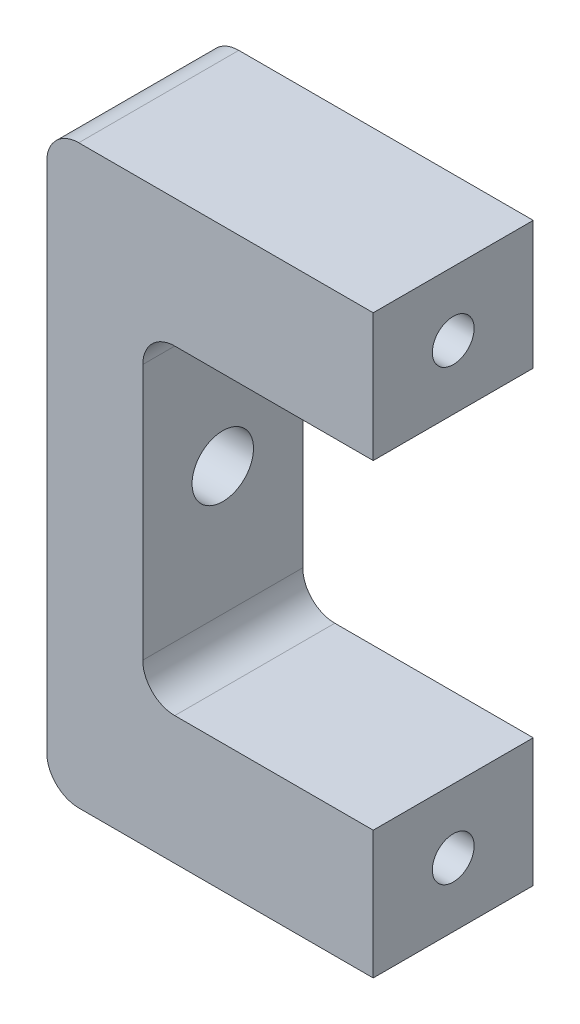
ISO-10303-21;
HEADER;
FILE_DESCRIPTION(('STEP AP214'),'2;1');
FILE_NAME('part.step','',(''),(''),'','','');
FILE_SCHEMA(('AUTOMOTIVE_DESIGN { 1 0 10303 214 1 1 1 1 }'));
ENDSEC;
DATA;
#1=APPLICATION_CONTEXT('core data for automotive mechanical design processes');
#2=APPLICATION_PROTOCOL_DEFINITION('international standard','automotive_design',2000,#1);
#3=PRODUCT_CONTEXT('',#1,'mechanical');
#4=PRODUCT('Part','Part','',(#3));
#5=PRODUCT_RELATED_PRODUCT_CATEGORY('part','',(#4));
#6=PRODUCT_DEFINITION_FORMATION('','',#4);
#7=PRODUCT_DEFINITION_CONTEXT('part definition',#1,'design');
#8=PRODUCT_DEFINITION('design','',#6,#7);
#9=PRODUCT_DEFINITION_SHAPE('','',#8);
#10=(LENGTH_UNIT() NAMED_UNIT(*) SI_UNIT(.MILLI.,.METRE.));
#11=(NAMED_UNIT(*) PLANE_ANGLE_UNIT() SI_UNIT($,.RADIAN.));
#12=(NAMED_UNIT(*) SI_UNIT($,.STERADIAN.) SOLID_ANGLE_UNIT());
#13=UNCERTAINTY_MEASURE_WITH_UNIT(LENGTH_MEASURE(1.E-05),#10,'distance_accuracy_value','');
#14=(GEOMETRIC_REPRESENTATION_CONTEXT(3) GLOBAL_UNCERTAINTY_ASSIGNED_CONTEXT((#13)) GLOBAL_UNIT_ASSIGNED_CONTEXT((#10,
#11,#12)) REPRESENTATION_CONTEXT('',''));
#15=CARTESIAN_POINT('',(0.,0.,0.));
#16=DIRECTION('',(0.,0.,1.));
#17=DIRECTION('',(1.,0.,0.));
#18=AXIS2_PLACEMENT_3D('',#15,#16,#17);
#19=CARTESIAN_POINT('',(-33.,0.,25.));
#20=DIRECTION('',(1.,0.,0.));
#21=DIRECTION('',(0.,0.,-1.));
#22=AXIS2_PLACEMENT_3D('',#19,#20,#21);
#23=PLANE('',#22);
#24=CARTESIAN_POINT('',(-33.,35.,12.5));
#25=DIRECTION('',(-1.,0.,0.));
#26=DIRECTION('',(0.,0.,1.));
#27=AXIS2_PLACEMENT_3D('',#24,#25,#26);
#28=CIRCLE('',#27,5.55625);
#29=CARTESIAN_POINT('',(-33.,40.,10.0767967352077));
#30=VERTEX_POINT('',#29);
#31=CARTESIAN_POINT('',(-33.,40.,14.9232032647923));
#32=VERTEX_POINT('',#31);
#33=EDGE_CURVE('E61',#30,#32,#28,.T.);
#34=ORIENTED_EDGE('',*,*,#33,.F.);
#35=DIRECTION('',(0.,0.,-1.));
#36=VECTOR('',#35,1.);
#37=CARTESIAN_POINT('',(-33.,40.,25.));
#38=LINE('',#37,#36);
#39=CARTESIAN_POINT('',(-33.,40.,0.));
#40=VERTEX_POINT('',#39);
#41=EDGE_CURVE('E153',#30,#40,#38,.T.);
#42=ORIENTED_EDGE('',*,*,#41,.T.);
#43=DIRECTION('',(0.,-1.,0.));
#44=VECTOR('',#43,1.);
#45=CARTESIAN_POINT('',(-33.,0.,0.));
#46=LINE('',#45,#44);
#47=CARTESIAN_POINT('',(-33.,-40.,0.));
#48=VERTEX_POINT('',#47);
#49=EDGE_CURVE('E326',#40,#48,#46,.T.);
#50=ORIENTED_EDGE('',*,*,#49,.T.);
#51=DIRECTION('',(0.,0.,-1.));
#52=VECTOR('',#51,1.);
#53=CARTESIAN_POINT('',(-33.,-40.,25.));
#54=LINE('',#53,#52);
#55=CARTESIAN_POINT('',(-33.,-40.,10.0767967352077));
#56=VERTEX_POINT('',#55);
#57=EDGE_CURVE('E173',#48,#56,#54,.F.);
#58=ORIENTED_EDGE('',*,*,#57,.T.);
#59=CARTESIAN_POINT('',(-33.,-35.,12.5));
#60=DIRECTION('',(-1.,0.,0.));
#61=DIRECTION('',(0.,0.,1.));
#62=AXIS2_PLACEMENT_3D('',#59,#60,#61);
#63=CIRCLE('',#62,5.55625);
#64=CARTESIAN_POINT('',(-33.,-40.,14.9232032647923));
#65=VERTEX_POINT('',#64);
#66=EDGE_CURVE('E68',#65,#56,#63,.T.);
#67=ORIENTED_EDGE('',*,*,#66,.F.);
#68=CARTESIAN_POINT('',(-33.,-40.,25.));
#69=VERTEX_POINT('',#68);
#70=EDGE_CURVE('E169',#65,#69,#54,.F.);
#71=ORIENTED_EDGE('',*,*,#70,.T.);
#72=DIRECTION('',(0.,-1.,0.));
#73=VECTOR('',#72,1.);
#74=CARTESIAN_POINT('',(-33.,0.,25.));
#75=LINE('',#74,#73);
#76=CARTESIAN_POINT('',(-33.,40.,25.));
#77=VERTEX_POINT('',#76);
#78=EDGE_CURVE('E355',#77,#69,#75,.T.);
#79=ORIENTED_EDGE('',*,*,#78,.F.);
#80=EDGE_CURVE('E156',#77,#32,#38,.T.);
#81=ORIENTED_EDGE('',*,*,#80,.T.);
#82=EDGE_LOOP('',(#34,#42,#50,#58,#67,#71,#79,#81));
#83=FACE_BOUND('',#82,.T.);
#84=ADVANCED_FACE('F41',(#83),#23,.F.);
#85=CARTESIAN_POINT('',(18.,0.,25.));
#86=DIRECTION('',(1.,0.,0.));
#87=DIRECTION('',(0.,0.,-1.));
#88=AXIS2_PLACEMENT_3D('',#85,#86,#87);
#89=PLANE('',#88);
#90=CARTESIAN_POINT('',(18.,-35.,12.5));
#91=DIRECTION('',(1.,0.,0.));
#92=DIRECTION('',(0.,0.,-1.));
#93=AXIS2_PLACEMENT_3D('',#90,#91,#92);
#94=CIRCLE('',#93,3.26389999999999);
#95=CARTESIAN_POINT('',(18.,-35.,9.23610000000001));
#96=VERTEX_POINT('',#95);
#97=EDGE_CURVE('E285',#96,#96,#94,.T.);
#98=ORIENTED_EDGE('',*,*,#97,.F.);
#99=EDGE_LOOP('',(#98));
#100=FACE_BOUND('',#99,.T.);
#101=DIRECTION('',(0.,-1.,0.));
#102=VECTOR('',#101,1.);
#103=CARTESIAN_POINT('',(18.,0.,0.));
#104=LINE('',#103,#102);
#105=CARTESIAN_POINT('',(18.,-25.,0.));
#106=VERTEX_POINT('',#105);
#107=CARTESIAN_POINT('',(18.,-45.,0.));
#108=VERTEX_POINT('',#107);
#109=EDGE_CURVE('E288',#106,#108,#104,.T.);
#110=ORIENTED_EDGE('',*,*,#109,.F.);
#111=DIRECTION('',(0.,0.,-1.));
#112=VECTOR('',#111,1.);
#113=CARTESIAN_POINT('',(18.,-25.,25.));
#114=LINE('',#113,#112);
#115=CARTESIAN_POINT('',(18.,-25.,25.));
#116=VERTEX_POINT('',#115);
#117=EDGE_CURVE('E290',#116,#106,#114,.T.);
#118=ORIENTED_EDGE('',*,*,#117,.F.);
#119=DIRECTION('',(0.,-1.,0.));
#120=VECTOR('',#119,1.);
#121=CARTESIAN_POINT('',(18.,0.,25.));
#122=LINE('',#121,#120);
#123=CARTESIAN_POINT('',(18.,-45.,25.));
#124=VERTEX_POINT('',#123);
#125=EDGE_CURVE('E332',#116,#124,#122,.T.);
#126=ORIENTED_EDGE('',*,*,#125,.T.);
#127=DIRECTION('',(0.,0.,-1.));
#128=VECTOR('',#127,1.);
#129=CARTESIAN_POINT('',(18.,-45.,25.));
#130=LINE('',#129,#128);
#131=EDGE_CURVE('E292',#124,#108,#130,.T.);
#132=ORIENTED_EDGE('',*,*,#131,.T.);
#133=EDGE_LOOP('',(#110,#118,#126,#132));
#134=FACE_BOUND('',#133,.T.);
#135=ADVANCED_FACE('F259',(#100,#134),#89,.T.);
#136=CARTESIAN_POINT('',(0.,-25.,25.));
#137=DIRECTION('',(0.,-1.,0.));
#138=DIRECTION('',(0.,0.,-1.));
#139=AXIS2_PLACEMENT_3D('',#136,#137,#138);
#140=PLANE('',#139);
#141=DIRECTION('',(-1.,0.,0.));
#142=VECTOR('',#141,1.);
#143=CARTESIAN_POINT('',(0.,-25.,0.));
#144=LINE('',#143,#142);
#145=CARTESIAN_POINT('',(-13.,-25.,0.));
#146=VERTEX_POINT('',#145);
#147=EDGE_CURVE('E297',#106,#146,#144,.T.);
#148=ORIENTED_EDGE('',*,*,#147,.T.);
#149=DIRECTION('',(0.,0.,-1.));
#150=VECTOR('',#149,1.);
#151=CARTESIAN_POINT('',(-13.,-25.,25.));
#152=LINE('',#151,#150);
#153=CARTESIAN_POINT('',(-13.,-25.,25.));
#154=VERTEX_POINT('',#153);
#155=EDGE_CURVE('E193',#146,#154,#152,.F.);
#156=ORIENTED_EDGE('',*,*,#155,.T.);
#157=DIRECTION('',(-1.,0.,0.));
#158=VECTOR('',#157,1.);
#159=CARTESIAN_POINT('',(0.,-25.,25.));
#160=LINE('',#159,#158);
#161=EDGE_CURVE('E376',#116,#154,#160,.T.);
#162=ORIENTED_EDGE('',*,*,#161,.F.);
#163=ORIENTED_EDGE('',*,*,#117,.T.);
#164=EDGE_LOOP('',(#148,#156,#162,#163));
#165=FACE_BOUND('',#164,.T.);
#166=ADVANCED_FACE('F274',(#165),#140,.F.);
#167=CARTESIAN_POINT('',(-18.,0.,25.));
#168=DIRECTION('',(1.,0.,0.));
#169=DIRECTION('',(0.,0.,-1.));
#170=AXIS2_PLACEMENT_3D('',#167,#168,#169);
#171=PLANE('',#170);
#172=CARTESIAN_POINT('',(-18.,0.,12.5));
#173=DIRECTION('',(1.,0.,0.));
#174=DIRECTION('',(0.,1.,0.));
#175=AXIS2_PLACEMENT_3D('',#172,#173,#174);
#176=CIRCLE('',#175,4.8);
#177=CARTESIAN_POINT('',(-18.,4.8,12.5));
#178=VERTEX_POINT('',#177);
#179=EDGE_CURVE('E306',#178,#178,#176,.T.);
#180=ORIENTED_EDGE('',*,*,#179,.F.);
#181=EDGE_LOOP('',(#180));
#182=FACE_BOUND('',#181,.T.);
#183=DIRECTION('',(0.,-1.,0.));
#184=VECTOR('',#183,1.);
#185=CARTESIAN_POINT('',(-18.,0.,25.));
#186=LINE('',#185,#184);
#187=CARTESIAN_POINT('',(-18.,20.,25.));
#188=VERTEX_POINT('',#187);
#189=CARTESIAN_POINT('',(-18.,-20.,25.));
#190=VERTEX_POINT('',#189);
#191=EDGE_CURVE('E372',#188,#190,#186,.T.);
#192=ORIENTED_EDGE('',*,*,#191,.T.);
#193=DIRECTION('',(0.,0.,-1.));
#194=VECTOR('',#193,1.);
#195=CARTESIAN_POINT('',(-18.,-20.,25.));
#196=LINE('',#195,#194);
#197=CARTESIAN_POINT('',(-18.,-20.,0.));
#198=VERTEX_POINT('',#197);
#199=EDGE_CURVE('E189',#190,#198,#196,.T.);
#200=ORIENTED_EDGE('',*,*,#199,.T.);
#201=DIRECTION('',(0.,-1.,0.));
#202=VECTOR('',#201,1.);
#203=CARTESIAN_POINT('',(-18.,0.,0.));
#204=LINE('',#203,#202);
#205=CARTESIAN_POINT('',(-18.,20.,0.));
#206=VERTEX_POINT('',#205);
#207=EDGE_CURVE('E303',#206,#198,#204,.T.);
#208=ORIENTED_EDGE('',*,*,#207,.F.);
#209=DIRECTION('',(0.,0.,-1.));
#210=VECTOR('',#209,1.);
#211=CARTESIAN_POINT('',(-18.,20.,25.));
#212=LINE('',#211,#210);
#213=EDGE_CURVE('E186',#206,#188,#212,.F.);
#214=ORIENTED_EDGE('',*,*,#213,.T.);
#215=EDGE_LOOP('',(#192,#200,#208,#214));
#216=FACE_BOUND('',#215,.T.);
#217=ADVANCED_FACE('F270',(#182,#216),#171,.T.);
#218=CARTESIAN_POINT('',(0.,25.,25.));
#219=DIRECTION('',(0.,-1.,0.));
#220=DIRECTION('',(0.,0.,-1.));
#221=AXIS2_PLACEMENT_3D('',#218,#219,#220);
#222=PLANE('',#221);
#223=DIRECTION('',(-1.,0.,0.));
#224=VECTOR('',#223,1.);
#225=CARTESIAN_POINT('',(0.,25.,25.));
#226=LINE('',#225,#224);
#227=CARTESIAN_POINT('',(18.,25.,25.));
#228=VERTEX_POINT('',#227);
#229=CARTESIAN_POINT('',(-13.,25.,25.));
#230=VERTEX_POINT('',#229);
#231=EDGE_CURVE('E368',#228,#230,#226,.T.);
#232=ORIENTED_EDGE('',*,*,#231,.T.);
#233=DIRECTION('',(0.,0.,-1.));
#234=VECTOR('',#233,1.);
#235=CARTESIAN_POINT('',(-13.,25.,0.));
#236=LINE('',#235,#234);
#237=CARTESIAN_POINT('',(-13.,25.,0.));
#238=VERTEX_POINT('',#237);
#239=EDGE_CURVE('E196',#230,#238,#236,.T.);
#240=ORIENTED_EDGE('',*,*,#239,.T.);
#241=DIRECTION('',(-1.,0.,0.));
#242=VECTOR('',#241,1.);
#243=CARTESIAN_POINT('',(0.,25.,0.));
#244=LINE('',#243,#242);
#245=CARTESIAN_POINT('',(18.,25.,0.));
#246=VERTEX_POINT('',#245);
#247=EDGE_CURVE('E315',#246,#238,#244,.T.);
#248=ORIENTED_EDGE('',*,*,#247,.F.);
#249=DIRECTION('',(0.,0.,-1.));
#250=VECTOR('',#249,1.);
#251=CARTESIAN_POINT('',(18.,25.,25.));
#252=LINE('',#251,#250);
#253=EDGE_CURVE('E339',#228,#246,#252,.T.);
#254=ORIENTED_EDGE('',*,*,#253,.F.);
#255=EDGE_LOOP('',(#232,#240,#248,#254));
#256=FACE_BOUND('',#255,.T.);
#257=ADVANCED_FACE('F266',(#256),#222,.T.);
#258=CARTESIAN_POINT('',(18.,0.,25.));
#259=DIRECTION('',(-1.,0.,0.));
#260=DIRECTION('',(0.,0.,1.));
#261=AXIS2_PLACEMENT_3D('',#258,#259,#260);
#262=PLANE('',#261);
#263=CARTESIAN_POINT('',(18.,35.,12.5));
#264=DIRECTION('',(-1.,0.,0.));
#265=DIRECTION('',(0.,0.,1.));
#266=AXIS2_PLACEMENT_3D('',#263,#264,#265);
#267=CIRCLE('',#266,3.26389999999999);
#268=CARTESIAN_POINT('',(18.,35.,15.7639));
#269=VERTEX_POINT('',#268);
#270=EDGE_CURVE('E397',#269,#269,#267,.T.);
#271=ORIENTED_EDGE('',*,*,#270,.T.);
#272=EDGE_LOOP('',(#271));
#273=FACE_BOUND('',#272,.T.);
#274=DIRECTION('',(0.,1.,0.));
#275=VECTOR('',#274,1.);
#276=CARTESIAN_POINT('',(18.,0.,0.));
#277=LINE('',#276,#275);
#278=CARTESIAN_POINT('',(18.,45.,0.));
#279=VERTEX_POINT('',#278);
#280=EDGE_CURVE('E319',#246,#279,#277,.T.);
#281=ORIENTED_EDGE('',*,*,#280,.T.);
#282=DIRECTION('',(0.,0.,-1.));
#283=VECTOR('',#282,1.);
#284=CARTESIAN_POINT('',(18.,45.,25.));
#285=LINE('',#284,#283);
#286=CARTESIAN_POINT('',(18.,45.,25.));
#287=VERTEX_POINT('',#286);
#288=EDGE_CURVE('E335',#287,#279,#285,.T.);
#289=ORIENTED_EDGE('',*,*,#288,.F.);
#290=DIRECTION('',(0.,1.,0.));
#291=VECTOR('',#290,1.);
#292=CARTESIAN_POINT('',(18.,0.,25.));
#293=LINE('',#292,#291);
#294=EDGE_CURVE('E363',#228,#287,#293,.T.);
#295=ORIENTED_EDGE('',*,*,#294,.F.);
#296=ORIENTED_EDGE('',*,*,#253,.T.);
#297=EDGE_LOOP('',(#281,#289,#295,#296));
#298=FACE_BOUND('',#297,.T.);
#299=ADVANCED_FACE('F262',(#273,#298),#262,.F.);
#300=CARTESIAN_POINT('',(0.,45.,25.));
#301=DIRECTION('',(0.,-1.,0.));
#302=DIRECTION('',(0.,0.,-1.));
#303=AXIS2_PLACEMENT_3D('',#300,#301,#302);
#304=PLANE('',#303);
#305=DIRECTION('',(-1.,0.,0.));
#306=VECTOR('',#305,1.);
#307=CARTESIAN_POINT('',(0.,45.,0.));
#308=LINE('',#307,#306);
#309=CARTESIAN_POINT('',(-28.,45.,0.));
#310=VERTEX_POINT('',#309);
#311=EDGE_CURVE('E322',#279,#310,#308,.T.);
#312=ORIENTED_EDGE('',*,*,#311,.T.);
#313=DIRECTION('',(0.,0.,-1.));
#314=VECTOR('',#313,1.);
#315=CARTESIAN_POINT('',(-28.,45.,25.));
#316=LINE('',#315,#314);
#317=CARTESIAN_POINT('',(-28.,45.,25.));
#318=VERTEX_POINT('',#317);
#319=EDGE_CURVE('E183',#310,#318,#316,.F.);
#320=ORIENTED_EDGE('',*,*,#319,.T.);
#321=DIRECTION('',(-1.,0.,0.));
#322=VECTOR('',#321,1.);
#323=CARTESIAN_POINT('',(0.,45.,25.));
#324=LINE('',#323,#322);
#325=EDGE_CURVE('E357',#287,#318,#324,.T.);
#326=ORIENTED_EDGE('',*,*,#325,.F.);
#327=ORIENTED_EDGE('',*,*,#288,.T.);
#328=EDGE_LOOP('',(#312,#320,#326,#327));
#329=FACE_BOUND('',#328,.T.);
#330=ADVANCED_FACE('F255',(#329),#304,.F.);
#331=CARTESIAN_POINT('',(0.,-45.,25.));
#332=DIRECTION('',(0.,-1.,0.));
#333=DIRECTION('',(0.,0.,-1.));
#334=AXIS2_PLACEMENT_3D('',#331,#332,#333);
#335=PLANE('',#334);
#336=DIRECTION('',(-1.,0.,0.));
#337=VECTOR('',#336,1.);
#338=CARTESIAN_POINT('',(0.,-45.,25.));
#339=LINE('',#338,#337);
#340=CARTESIAN_POINT('',(-28.,-45.,25.));
#341=VERTEX_POINT('',#340);
#342=EDGE_CURVE('E309',#124,#341,#339,.T.);
#343=ORIENTED_EDGE('',*,*,#342,.T.);
#344=DIRECTION('',(0.,0.,-1.));
#345=VECTOR('',#344,1.);
#346=CARTESIAN_POINT('',(-28.,-45.,0.));
#347=LINE('',#346,#345);
#348=CARTESIAN_POINT('',(-28.,-45.,0.));
#349=VERTEX_POINT('',#348);
#350=EDGE_CURVE('E344',#341,#349,#347,.T.);
#351=ORIENTED_EDGE('',*,*,#350,.T.);
#352=DIRECTION('',(-1.,0.,0.));
#353=VECTOR('',#352,1.);
#354=CARTESIAN_POINT('',(0.,-45.,0.));
#355=LINE('',#354,#353);
#356=EDGE_CURVE('E329',#108,#349,#355,.T.);
#357=ORIENTED_EDGE('',*,*,#356,.F.);
#358=ORIENTED_EDGE('',*,*,#131,.F.);
#359=EDGE_LOOP('',(#343,#351,#357,#358));
#360=FACE_BOUND('',#359,.T.);
#361=ADVANCED_FACE('F248',(#360),#335,.T.);
#362=CARTESIAN_POINT('',(0.,0.,25.));
#363=DIRECTION('',(0.,0.,1.));
#364=DIRECTION('',(1.,0.,0.));
#365=AXIS2_PLACEMENT_3D('',#362,#363,#364);
#366=PLANE('',#365);
#367=ORIENTED_EDGE('',*,*,#78,.T.);
#368=CARTESIAN_POINT('',(-28.,-40.,25.));
#369=DIRECTION('',(0.,0.,1.));
#370=DIRECTION('',(1.,0.,0.));
#371=AXIS2_PLACEMENT_3D('',#368,#369,#370);
#372=CIRCLE('',#371,5.);
#373=EDGE_CURVE('E180',#69,#341,#372,.T.);
#374=ORIENTED_EDGE('',*,*,#373,.T.);
#375=ORIENTED_EDGE('',*,*,#342,.F.);
#376=ORIENTED_EDGE('',*,*,#125,.F.);
#377=ORIENTED_EDGE('',*,*,#161,.T.);
#378=CARTESIAN_POINT('',(-13.,-20.,25.));
#379=DIRECTION('',(0.,0.,1.));
#380=DIRECTION('',(1.,0.,0.));
#381=AXIS2_PLACEMENT_3D('',#378,#379,#380);
#382=CIRCLE('',#381,5.);
#383=EDGE_CURVE('E203',#154,#190,#382,.F.);
#384=ORIENTED_EDGE('',*,*,#383,.T.);
#385=ORIENTED_EDGE('',*,*,#191,.F.);
#386=CARTESIAN_POINT('',(-13.,20.,25.));
#387=DIRECTION('',(0.,0.,1.));
#388=DIRECTION('',(1.,0.,0.));
#389=AXIS2_PLACEMENT_3D('',#386,#387,#388);
#390=CIRCLE('',#389,5.);
#391=EDGE_CURVE('E209',#188,#230,#390,.F.);
#392=ORIENTED_EDGE('',*,*,#391,.T.);
#393=ORIENTED_EDGE('',*,*,#231,.F.);
#394=ORIENTED_EDGE('',*,*,#294,.T.);
#395=ORIENTED_EDGE('',*,*,#325,.T.);
#396=CARTESIAN_POINT('',(-28.,40.,25.));
#397=DIRECTION('',(0.,0.,1.));
#398=DIRECTION('',(1.,0.,0.));
#399=AXIS2_PLACEMENT_3D('',#396,#397,#398);
#400=CIRCLE('',#399,5.);
#401=EDGE_CURVE('E177',#318,#77,#400,.T.);
#402=ORIENTED_EDGE('',*,*,#401,.T.);
#403=EDGE_LOOP('',(#367,#374,#375,#376,#377,#384,#385,#392,#393,#394,#395,#402));
#404=FACE_BOUND('',#403,.T.);
#405=ADVANCED_FACE('F245',(#404),#366,.T.);
#406=CARTESIAN_POINT('',(0.,0.,0.));
#407=DIRECTION('',(0.,0.,1.));
#408=DIRECTION('',(1.,0.,0.));
#409=AXIS2_PLACEMENT_3D('',#406,#407,#408);
#410=PLANE('',#409);
#411=ORIENTED_EDGE('',*,*,#356,.T.);
#412=CARTESIAN_POINT('',(-28.,-40.,0.));
#413=DIRECTION('',(0.,0.,1.));
#414=DIRECTION('',(1.,0.,0.));
#415=AXIS2_PLACEMENT_3D('',#412,#413,#414);
#416=CIRCLE('',#415,5.);
#417=EDGE_CURVE('E165',#349,#48,#416,.F.);
#418=ORIENTED_EDGE('',*,*,#417,.T.);
#419=ORIENTED_EDGE('',*,*,#49,.F.);
#420=CARTESIAN_POINT('',(-28.,40.,0.));
#421=DIRECTION('',(0.,0.,1.));
#422=DIRECTION('',(1.,0.,0.));
#423=AXIS2_PLACEMENT_3D('',#420,#421,#422);
#424=CIRCLE('',#423,5.);
#425=EDGE_CURVE('E162',#40,#310,#424,.F.);
#426=ORIENTED_EDGE('',*,*,#425,.T.);
#427=ORIENTED_EDGE('',*,*,#311,.F.);
#428=ORIENTED_EDGE('',*,*,#280,.F.);
#429=ORIENTED_EDGE('',*,*,#247,.T.);
#430=CARTESIAN_POINT('',(-13.,20.,0.));
#431=DIRECTION('',(0.,0.,1.));
#432=DIRECTION('',(1.,0.,0.));
#433=AXIS2_PLACEMENT_3D('',#430,#431,#432);
#434=CIRCLE('',#433,5.);
#435=EDGE_CURVE('E206',#238,#206,#434,.T.);
#436=ORIENTED_EDGE('',*,*,#435,.T.);
#437=ORIENTED_EDGE('',*,*,#207,.T.);
#438=CARTESIAN_POINT('',(-13.,-20.,0.));
#439=DIRECTION('',(0.,0.,1.));
#440=DIRECTION('',(1.,0.,0.));
#441=AXIS2_PLACEMENT_3D('',#438,#439,#440);
#442=CIRCLE('',#441,5.);
#443=EDGE_CURVE('E200',#198,#146,#442,.T.);
#444=ORIENTED_EDGE('',*,*,#443,.T.);
#445=ORIENTED_EDGE('',*,*,#147,.F.);
#446=ORIENTED_EDGE('',*,*,#109,.T.);
#447=EDGE_LOOP('',(#411,#418,#419,#426,#427,#428,#429,#436,#437,#444,#445,#446));
#448=FACE_BOUND('',#447,.T.);
#449=ADVANCED_FACE('F243',(#448),#410,.F.);
#450=CARTESIAN_POINT('',(-25.5,0.,12.5));
#451=DIRECTION('',(1.,0.,0.));
#452=DIRECTION('',(0.,1.,0.));
#453=AXIS2_PLACEMENT_3D('',#450,#451,#452);
#454=CYLINDRICAL_SURFACE('',#453,4.8);
#455=CARTESIAN_POINT('',(-25.5,0.,12.5));
#456=DIRECTION('',(1.,0.,0.));
#457=DIRECTION('',(0.,1.,0.));
#458=AXIS2_PLACEMENT_3D('',#455,#456,#457);
#459=CIRCLE('',#458,4.8);
#460=CARTESIAN_POINT('',(-25.5,4.8,12.5));
#461=VERTEX_POINT('',#460);
#462=EDGE_CURVE('E298',#461,#461,#459,.T.);
#463=ORIENTED_EDGE('',*,*,#462,.F.);
#464=EDGE_LOOP('',(#463));
#465=FACE_BOUND('',#464,.T.);
#466=ORIENTED_EDGE('',*,*,#179,.T.);
#467=EDGE_LOOP('',(#466));
#468=FACE_BOUND('',#467,.T.);
#469=ADVANCED_FACE('F239',(#465,#468),#454,.F.);
#470=CARTESIAN_POINT('',(-25.5,0.,12.5));
#471=DIRECTION('',(1.,0.,0.));
#472=DIRECTION('',(0.,1.,0.));
#473=AXIS2_PLACEMENT_3D('',#470,#471,#472);
#474=PLANE('',#473);
#475=ORIENTED_EDGE('',*,*,#462,.T.);
#476=EDGE_LOOP('',(#475));
#477=FACE_BOUND('',#476,.T.);
#478=ADVANCED_FACE('F236',(#477),#474,.T.);
#479=CARTESIAN_POINT('',(-28.,-40.,25.));
#480=DIRECTION('',(0.,0.,1.));
#481=DIRECTION('',(1.,0.,0.));
#482=AXIS2_PLACEMENT_3D('',#479,#480,#481);
#483=CYLINDRICAL_SURFACE('',#482,5.);
#484=CARTESIAN_POINT('',(-33.,-40.,10.0767967352077));
#485=CARTESIAN_POINT('',(-32.9999606934098,-40.0680826399423,10.2172404393263));
#486=CARTESIAN_POINT('',(-32.9986076451675,-40.1302117853059,10.3605511070839));
#487=CARTESIAN_POINT('',(-32.9944556115313,-40.2421948955034,10.6518636708405));
#488=CARTESIAN_POINT('',(-32.99165670601,-40.2920495381841,10.7998653072757));
#489=CARTESIAN_POINT('',(-32.9857964719034,-40.3790898829522,11.0994186950217));
#490=CARTESIAN_POINT('',(-32.9827353448826,-40.4162852085471,11.2509676555918));
#491=CARTESIAN_POINT('',(-32.9772147077075,-40.4778036915328,11.55666301251));
#492=CARTESIAN_POINT('',(-32.9747551784109,-40.502127258518,11.7108093260463));
#493=CARTESIAN_POINT('',(-32.9710313595694,-40.5377429930774,12.0207581381976));
#494=CARTESIAN_POINT('',(-32.969768158339,-40.5490232970892,12.176562014698));
#495=CARTESIAN_POINT('',(-32.968720008732,-40.5584300709879,12.48857095794));
#496=CARTESIAN_POINT('',(-32.9689350687215,-40.556556466432,12.644776026947));
#497=CARTESIAN_POINT('',(-32.9707974439844,-40.5396723299053,12.9563585426201));
#498=CARTESIAN_POINT('',(-32.9724437265869,-40.5246712697444,13.1117365047592));
#499=CARTESIAN_POINT('',(-32.9767911590036,-40.4816712158676,13.4206085389016));
#500=CARTESIAN_POINT('',(-32.9794920808998,-40.4536750302797,13.5741030105582));
#501=CARTESIAN_POINT('',(-32.9863306394235,-40.3724926160432,13.9328580002494));
#502=CARTESIAN_POINT('',(-32.9906359979566,-40.3138717318717,14.1369245247813));
#503=CARTESIAN_POINT('',(-32.9957578926843,-40.2088263539984,14.4368219924604));
#504=CARTESIAN_POINT('',(-32.9972423106542,-40.1709696649972,14.535731840553));
#505=CARTESIAN_POINT('',(-32.9993608264882,-40.0896559578142,14.7312598485097));
#506=CARTESIAN_POINT('',(-32.999994711906,-40.0461975434018,14.827877429893));
#507=CARTESIAN_POINT('',(-33.,-40.,14.9232032647923));
#508=B_SPLINE_CURVE_WITH_KNOTS('',3,(#484,#485,#486,#487,#488,#489,#490,#491,#492,#493,#494,
#495,#496,#497,#498,#499,#500,#501,#502,#503,#504,#505,#506,#507),.UNSPECIFIED.,.F.,.F.,(4,2,2,
2,2,2,2,2,2,2,2,4),(0.,0.468061165215406,0.936096476433838,1.40377519222727,1.87143902505,
2.33952788998368,2.80761940400833,3.27537345571553,3.74302647706542,4.37853078250971,
4.69613542634235,5.01381938680266),.UNSPECIFIED.);
#509=EDGE_CURVE('E56',#56,#65,#508,.T.);
#510=ORIENTED_EDGE('',*,*,#509,.F.);
#511=ORIENTED_EDGE('',*,*,#57,.F.);
#512=ORIENTED_EDGE('',*,*,#417,.F.);
#513=ORIENTED_EDGE('',*,*,#350,.F.);
#514=ORIENTED_EDGE('',*,*,#373,.F.);
#515=ORIENTED_EDGE('',*,*,#70,.F.);
#516=EDGE_LOOP('',(#510,#511,#512,#513,#514,#515));
#517=FACE_BOUND('',#516,.T.);
#518=ADVANCED_FACE('F218',(#517),#483,.T.);
#519=CARTESIAN_POINT('',(-28.,40.,25.));
#520=DIRECTION('',(0.,0.,-1.));
#521=DIRECTION('',(-1.,0.,0.));
#522=AXIS2_PLACEMENT_3D('',#519,#520,#521);
#523=CYLINDRICAL_SURFACE('',#522,5.);
#524=CARTESIAN_POINT('',(-33.,40.,14.9232032647923));
#525=CARTESIAN_POINT('',(-32.9999606934098,40.0680826399423,14.7827595606737));
#526=CARTESIAN_POINT('',(-32.9986076451675,40.1302117853059,14.6394488929161));
#527=CARTESIAN_POINT('',(-32.9944556115313,40.2421948955034,14.3481363291595));
#528=CARTESIAN_POINT('',(-32.99165670601,40.2920495381841,14.2001346927243));
#529=CARTESIAN_POINT('',(-32.9857964719034,40.3790898829522,13.9005813049783));
#530=CARTESIAN_POINT('',(-32.9827353448826,40.4162852085471,13.7490323444082));
#531=CARTESIAN_POINT('',(-32.9772147077075,40.4778036915328,13.44333698749));
#532=CARTESIAN_POINT('',(-32.9747551784109,40.502127258518,13.2891906739537));
#533=CARTESIAN_POINT('',(-32.9710313595694,40.5377429930774,12.9792418618024));
#534=CARTESIAN_POINT('',(-32.969768158339,40.5490232970892,12.823437985302));
#535=CARTESIAN_POINT('',(-32.968720008732,40.5584300709879,12.51142904206));
#536=CARTESIAN_POINT('',(-32.9689350687215,40.556556466432,12.3552239730529));
#537=CARTESIAN_POINT('',(-32.9707974439844,40.5396723299053,12.0436414573799));
#538=CARTESIAN_POINT('',(-32.9724437265869,40.5246712697444,11.8882634952408));
#539=CARTESIAN_POINT('',(-32.9767911590036,40.4816712158676,11.5793914610984));
#540=CARTESIAN_POINT('',(-32.9794920808998,40.4536750302797,11.4258969894418));
#541=CARTESIAN_POINT('',(-32.9863306394235,40.3724926160432,11.0671419997506));
#542=CARTESIAN_POINT('',(-32.9906359979566,40.3138717318717,10.8630754752187));
#543=CARTESIAN_POINT('',(-32.9957578926843,40.2088263539984,10.5631780075396));
#544=CARTESIAN_POINT('',(-32.9972423106542,40.1709696649972,10.464268159447));
#545=CARTESIAN_POINT('',(-32.9993608264882,40.0896559578142,10.2687401514903));
#546=CARTESIAN_POINT('',(-32.999994711906,40.0461975434018,10.1721225701071));
#547=CARTESIAN_POINT('',(-33.,40.,10.0767967352077));
#548=B_SPLINE_CURVE_WITH_KNOTS('',3,(#524,#525,#526,#527,#528,#529,#530,#531,#532,#533,#534,
#535,#536,#537,#538,#539,#540,#541,#542,#543,#544,#545,#546,#547),.UNSPECIFIED.,.F.,.F.,(4,2,2,
2,2,2,2,2,2,2,2,4),(0.,0.468061165215407,0.936096476433839,1.40377519222727,1.87143902504999,
2.33952788998367,2.80761940400832,3.27537345571553,3.74302647706541,4.3785307825097,
4.69613542634234,5.01381938680265),.UNSPECIFIED.);
#549=EDGE_CURVE('E11',#32,#30,#548,.T.);
#550=ORIENTED_EDGE('',*,*,#549,.F.);
#551=ORIENTED_EDGE('',*,*,#80,.F.);
#552=ORIENTED_EDGE('',*,*,#401,.F.);
#553=ORIENTED_EDGE('',*,*,#319,.F.);
#554=ORIENTED_EDGE('',*,*,#425,.F.);
#555=ORIENTED_EDGE('',*,*,#41,.F.);
#556=EDGE_LOOP('',(#550,#551,#552,#553,#554,#555));
#557=FACE_BOUND('',#556,.T.);
#558=ADVANCED_FACE('F160',(#557),#523,.T.);
#559=CARTESIAN_POINT('',(-13.,-20.,25.));
#560=DIRECTION('',(0.,0.,-1.));
#561=DIRECTION('',(-1.,0.,0.));
#562=AXIS2_PLACEMENT_3D('',#559,#560,#561);
#563=CYLINDRICAL_SURFACE('',#562,5.);
#564=ORIENTED_EDGE('',*,*,#383,.F.);
#565=ORIENTED_EDGE('',*,*,#155,.F.);
#566=ORIENTED_EDGE('',*,*,#443,.F.);
#567=ORIENTED_EDGE('',*,*,#199,.F.);
#568=EDGE_LOOP('',(#564,#565,#566,#567));
#569=FACE_BOUND('',#568,.T.);
#570=ADVANCED_FACE('F439',(#569),#563,.F.);
#571=CARTESIAN_POINT('',(-13.,20.,25.));
#572=DIRECTION('',(0.,0.,1.));
#573=DIRECTION('',(1.,0.,0.));
#574=AXIS2_PLACEMENT_3D('',#571,#572,#573);
#575=CYLINDRICAL_SURFACE('',#574,5.);
#576=ORIENTED_EDGE('',*,*,#391,.F.);
#577=ORIENTED_EDGE('',*,*,#213,.F.);
#578=ORIENTED_EDGE('',*,*,#435,.F.);
#579=ORIENTED_EDGE('',*,*,#239,.F.);
#580=EDGE_LOOP('',(#576,#577,#578,#579));
#581=FACE_BOUND('',#580,.T.);
#582=ADVANCED_FACE('F43',(#581),#575,.F.);
#583=CARTESIAN_POINT('',(-33.,-35.,12.5));
#584=DIRECTION('',(-1.,0.,0.));
#585=DIRECTION('',(0.,0.,1.));
#586=AXIS2_PLACEMENT_3D('',#583,#584,#585);
#587=CYLINDRICAL_SURFACE('',#586,3.26389999999999);
#588=CARTESIAN_POINT('',(-10.775,-35.,12.5));
#589=DIRECTION('',(-1.,0.,0.));
#590=DIRECTION('',(0.,0.,1.));
#591=AXIS2_PLACEMENT_3D('',#588,#589,#590);
#592=CIRCLE('',#591,3.2639);
#593=CARTESIAN_POINT('',(-10.775,-35.,15.7639));
#594=VERTEX_POINT('',#593);
#595=EDGE_CURVE('E387',#594,#594,#592,.T.);
#596=ORIENTED_EDGE('',*,*,#595,.T.);
#597=EDGE_LOOP('',(#596));
#598=FACE_BOUND('',#597,.T.);
#599=ORIENTED_EDGE('',*,*,#97,.T.);
#600=EDGE_LOOP('',(#599));
#601=FACE_BOUND('',#600,.T.);
#602=ADVANCED_FACE('F231',(#598,#601),#587,.F.);
#603=CARTESIAN_POINT('',(-10.775,-31.7361,12.5));
#604=DIRECTION('',(1.,0.,0.));
#605=DIRECTION('',(0.,0.,-1.));
#606=AXIS2_PLACEMENT_3D('',#603,#604,#605);
#607=PLANE('',#606);
#608=ORIENTED_EDGE('',*,*,#595,.F.);
#609=EDGE_LOOP('',(#608));
#610=FACE_BOUND('',#609,.T.);
#611=CARTESIAN_POINT('',(-10.775,-35.,12.5));
#612=DIRECTION('',(-1.,0.,0.));
#613=DIRECTION('',(0.,0.,1.));
#614=AXIS2_PLACEMENT_3D('',#611,#612,#613);
#615=CIRCLE('',#614,5.55625);
#616=CARTESIAN_POINT('',(-10.775,-35.,18.05625));
#617=VERTEX_POINT('',#616);
#618=EDGE_CURVE('E391',#617,#617,#615,.T.);
#619=ORIENTED_EDGE('',*,*,#618,.T.);
#620=EDGE_LOOP('',(#619));
#621=FACE_BOUND('',#620,.T.);
#622=ADVANCED_FACE('F227',(#610,#621),#607,.F.);
#623=CARTESIAN_POINT('',(-33.,-35.,12.5));
#624=DIRECTION('',(-1.,0.,0.));
#625=DIRECTION('',(0.,0.,1.));
#626=AXIS2_PLACEMENT_3D('',#623,#624,#625);
#627=CYLINDRICAL_SURFACE('',#626,5.55625);
#628=ORIENTED_EDGE('',*,*,#509,.T.);
#629=ORIENTED_EDGE('',*,*,#66,.T.);
#630=EDGE_LOOP('',(#628,#629));
#631=FACE_BOUND('',#630,.T.);
#632=ORIENTED_EDGE('',*,*,#618,.F.);
#633=EDGE_LOOP('',(#632));
#634=FACE_BOUND('',#633,.T.);
#635=ADVANCED_FACE('F221',(#631,#634),#627,.F.);
#636=CARTESIAN_POINT('',(-33.,35.,12.5));
#637=DIRECTION('',(-1.,0.,0.));
#638=DIRECTION('',(0.,0.,1.));
#639=AXIS2_PLACEMENT_3D('',#636,#637,#638);
#640=CYLINDRICAL_SURFACE('',#639,3.26389999999999);
#641=ORIENTED_EDGE('',*,*,#270,.F.);
#642=EDGE_LOOP('',(#641));
#643=FACE_BOUND('',#642,.T.);
#644=CARTESIAN_POINT('',(-10.775,35.,12.5));
#645=DIRECTION('',(-1.,0.,0.));
#646=DIRECTION('',(0.,0.,1.));
#647=AXIS2_PLACEMENT_3D('',#644,#645,#646);
#648=CIRCLE('',#647,3.2639);
#649=CARTESIAN_POINT('',(-10.775,35.,15.7639));
#650=VERTEX_POINT('',#649);
#651=EDGE_CURVE('E401',#650,#650,#648,.T.);
#652=ORIENTED_EDGE('',*,*,#651,.T.);
#653=EDGE_LOOP('',(#652));
#654=FACE_BOUND('',#653,.T.);
#655=ADVANCED_FACE('F226',(#643,#654),#640,.F.);
#656=CARTESIAN_POINT('',(-10.775,38.2639,12.5));
#657=DIRECTION('',(1.,0.,0.));
#658=DIRECTION('',(0.,0.,-1.));
#659=AXIS2_PLACEMENT_3D('',#656,#657,#658);
#660=PLANE('',#659);
#661=ORIENTED_EDGE('',*,*,#651,.F.);
#662=EDGE_LOOP('',(#661));
#663=FACE_BOUND('',#662,.T.);
#664=CARTESIAN_POINT('',(-10.775,35.,12.5));
#665=DIRECTION('',(-1.,0.,0.));
#666=DIRECTION('',(0.,0.,1.));
#667=AXIS2_PLACEMENT_3D('',#664,#665,#666);
#668=CIRCLE('',#667,5.55624999999999);
#669=CARTESIAN_POINT('',(-10.775,35.,18.05625));
#670=VERTEX_POINT('',#669);
#671=EDGE_CURVE('E158',#670,#670,#668,.T.);
#672=ORIENTED_EDGE('',*,*,#671,.T.);
#673=EDGE_LOOP('',(#672));
#674=FACE_BOUND('',#673,.T.);
#675=ADVANCED_FACE('F409',(#663,#674),#660,.F.);
#676=CARTESIAN_POINT('',(-33.,35.,12.5));
#677=DIRECTION('',(-1.,0.,0.));
#678=DIRECTION('',(0.,0.,1.));
#679=AXIS2_PLACEMENT_3D('',#676,#677,#678);
#680=CYLINDRICAL_SURFACE('',#679,5.55625);
#681=ORIENTED_EDGE('',*,*,#549,.T.);
#682=ORIENTED_EDGE('',*,*,#33,.T.);
#683=EDGE_LOOP('',(#681,#682));
#684=FACE_BOUND('',#683,.T.);
#685=ORIENTED_EDGE('',*,*,#671,.F.);
#686=EDGE_LOOP('',(#685));
#687=FACE_BOUND('',#686,.T.);
#688=ADVANCED_FACE('F145',(#684,#687),#680,.F.);
#689=CLOSED_SHELL('',(#84,#135,#166,#217,#257,#299,#330,#361,#405,#449,#469,#478,#518,#558,#570,
#582,#602,#622,#635,#655,#675,#688));
#690=MANIFOLD_SOLID_BREP('B2',#689);
#691=ADVANCED_BREP_SHAPE_REPRESENTATION('',(#18,#690),#14);
#692=SHAPE_DEFINITION_REPRESENTATION(#9,#691);
ENDSEC;
END-ISO-10303-21;
